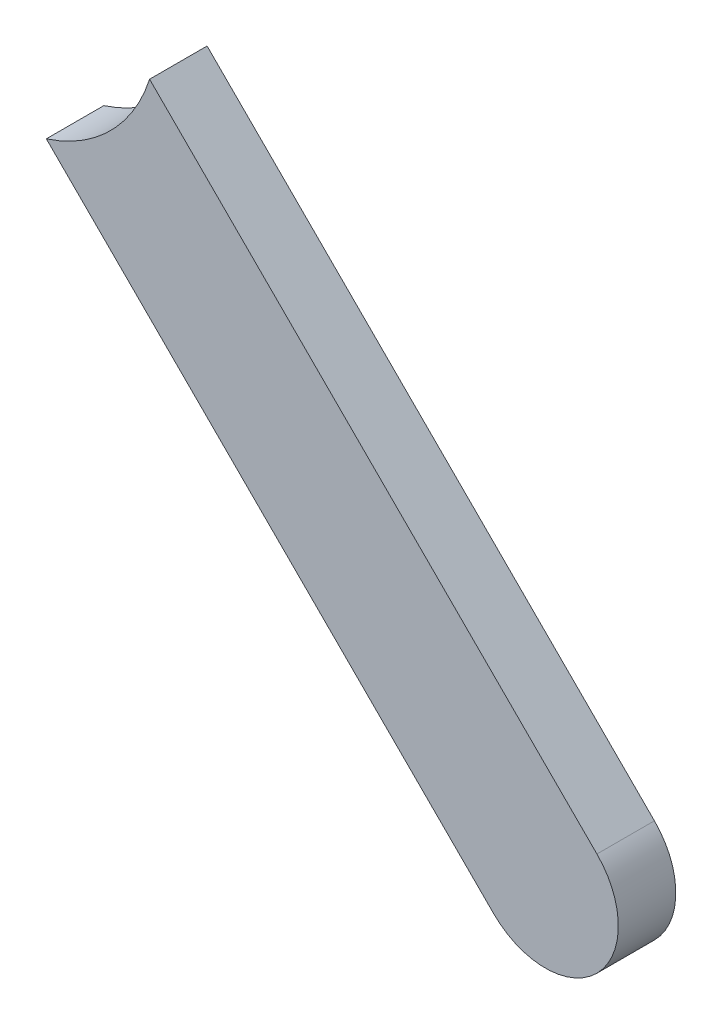
ISO-10303-21;
HEADER;
FILE_DESCRIPTION(('STEP AP214'),'2;1');
FILE_NAME('part.step','',(''),(''),'','','');
FILE_SCHEMA(('AUTOMOTIVE_DESIGN { 1 0 10303 214 1 1 1 1 }'));
ENDSEC;
DATA;
#1=APPLICATION_CONTEXT('core data for automotive mechanical design processes');
#2=APPLICATION_PROTOCOL_DEFINITION('international standard','automotive_design',2000,#1);
#3=PRODUCT_CONTEXT('',#1,'mechanical');
#4=PRODUCT('Part','Part','',(#3));
#5=PRODUCT_RELATED_PRODUCT_CATEGORY('part','',(#4));
#6=PRODUCT_DEFINITION_FORMATION('','',#4);
#7=PRODUCT_DEFINITION_CONTEXT('part definition',#1,'design');
#8=PRODUCT_DEFINITION('design','',#6,#7);
#9=PRODUCT_DEFINITION_SHAPE('','',#8);
#10=(LENGTH_UNIT() NAMED_UNIT(*) SI_UNIT(.MILLI.,.METRE.));
#11=(NAMED_UNIT(*) PLANE_ANGLE_UNIT() SI_UNIT($,.RADIAN.));
#12=(NAMED_UNIT(*) SI_UNIT($,.STERADIAN.) SOLID_ANGLE_UNIT());
#13=UNCERTAINTY_MEASURE_WITH_UNIT(LENGTH_MEASURE(1.E-05),#10,'distance_accuracy_value','');
#14=(GEOMETRIC_REPRESENTATION_CONTEXT(3) GLOBAL_UNCERTAINTY_ASSIGNED_CONTEXT((#13)) GLOBAL_UNIT_ASSIGNED_CONTEXT((#10,
#11,#12)) REPRESENTATION_CONTEXT('',''));
#15=CARTESIAN_POINT('',(0.,0.,0.));
#16=DIRECTION('',(0.,0.,1.));
#17=DIRECTION('',(1.,0.,0.));
#18=AXIS2_PLACEMENT_3D('',#15,#16,#17);
#19=CARTESIAN_POINT('',(94.0223271411441,75.1604637788559,0.));
#20=DIRECTION('',(0.707106781186545,0.70710678118655,0.));
#21=DIRECTION('',(0.70710678118655,-0.707106781186545,0.));
#22=AXIS2_PLACEMENT_3D('',#19,#20,#21);
#23=PLANE('',#22);
#24=DIRECTION('',(0.70710678118655,-0.707106781186545,0.));
#25=VECTOR('',#24,1.);
#26=CARTESIAN_POINT('',(93.67339406,75.50939686,0.1999996));
#27=LINE('',#26,#25);
#28=CARTESIAN_POINT('',(94.0223271411441,75.1604637788559,0.1999996));
#29=VERTEX_POINT('',#28);
#30=CARTESIAN_POINT('',(95.57839406,73.60439686,0.1999996));
#31=VERTEX_POINT('',#30);
#32=EDGE_CURVE('E11',#29,#31,#27,.T.);
#33=ORIENTED_EDGE('',*,*,#32,.F.);
#34=DIRECTION('',(0.,0.,1.));
#35=VECTOR('',#34,1.);
#36=CARTESIAN_POINT('',(94.0223271411441,75.1604637788559,0.));
#37=LINE('',#36,#35);
#38=CARTESIAN_POINT('',(94.0223271411441,75.1604637788559,0.));
#39=VERTEX_POINT('',#38);
#40=EDGE_CURVE('E24',#39,#29,#37,.T.);
#41=ORIENTED_EDGE('',*,*,#40,.F.);
#42=DIRECTION('',(0.70710678118655,-0.707106781186545,0.));
#43=VECTOR('',#42,1.);
#44=CARTESIAN_POINT('',(93.67339406,75.50939686,0.));
#45=LINE('',#44,#43);
#46=CARTESIAN_POINT('',(95.57839406,73.60439686,0.));
#47=VERTEX_POINT('',#46);
#48=EDGE_CURVE('E75',#39,#47,#45,.T.);
#49=ORIENTED_EDGE('',*,*,#48,.T.);
#50=DIRECTION('',(0.,0.,1.));
#51=VECTOR('',#50,1.);
#52=CARTESIAN_POINT('',(95.57839406,73.60439686,0.));
#53=LINE('',#52,#51);
#54=EDGE_CURVE('E37',#47,#31,#53,.T.);
#55=ORIENTED_EDGE('',*,*,#54,.T.);
#56=EDGE_LOOP('',(#33,#41,#49,#55));
#57=FACE_BOUND('',#56,.T.);
#58=ADVANCED_FACE('F17',(#57),#23,.F.);
#59=CARTESIAN_POINT('',(95.758,73.7840028,0.));
#60=DIRECTION('',(0.,0.,-1.));
#61=DIRECTION('',(-0.707106781186576,-0.70710678118652,0.));
#62=AXIS2_PLACEMENT_3D('',#59,#60,#61);
#63=CYLINDRICAL_SURFACE('',#62,0.254001156230764);
#64=CARTESIAN_POINT('',(95.758,73.7840028,0.1999996));
#65=DIRECTION('',(0.,0.,1.));
#66=DIRECTION('',(-0.707106781186576,-0.70710678118652,0.));
#67=AXIS2_PLACEMENT_3D('',#64,#65,#66);
#68=CIRCLE('',#67,0.254001156230764);
#69=CARTESIAN_POINT('',(95.93760594,73.96360874,0.1999996));
#70=VERTEX_POINT('',#69);
#71=EDGE_CURVE('E83',#31,#70,#68,.T.);
#72=ORIENTED_EDGE('',*,*,#71,.F.);
#73=ORIENTED_EDGE('',*,*,#54,.F.);
#74=CARTESIAN_POINT('',(95.758,73.7840028,0.));
#75=DIRECTION('',(0.,0.,1.));
#76=DIRECTION('',(-0.707106781186576,-0.70710678118652,0.));
#77=AXIS2_PLACEMENT_3D('',#74,#75,#76);
#78=CIRCLE('',#77,0.254001156230764);
#79=CARTESIAN_POINT('',(95.93760594,73.96360874,0.));
#80=VERTEX_POINT('',#79);
#81=EDGE_CURVE('E81',#47,#80,#78,.T.);
#82=ORIENTED_EDGE('',*,*,#81,.T.);
#83=DIRECTION('',(0.,0.,1.));
#84=VECTOR('',#83,1.);
#85=CARTESIAN_POINT('',(95.93760594,73.96360874,0.));
#86=LINE('',#85,#84);
#87=EDGE_CURVE('E67',#80,#70,#86,.T.);
#88=ORIENTED_EDGE('',*,*,#87,.T.);
#89=EDGE_LOOP('',(#72,#73,#82,#88));
#90=FACE_BOUND('',#89,.T.);
#91=ADVANCED_FACE('F89',(#90),#63,.T.);
#92=CARTESIAN_POINT('',(95.93760594,73.96360874,0.));
#93=DIRECTION('',(-0.707106781186548,-0.707106781186548,0.));
#94=DIRECTION('',(-0.707106781186548,0.707106781186548,0.));
#95=AXIS2_PLACEMENT_3D('',#92,#93,#94);
#96=PLANE('',#95);
#97=DIRECTION('',(-0.707106781186548,0.707106781186548,0.));
#98=VECTOR('',#97,1.);
#99=CARTESIAN_POINT('',(95.93760594,73.96360874,0.1999996));
#100=LINE('',#99,#98);
#101=CARTESIAN_POINT('',(94.3815390211441,75.5196756588559,0.1999996));
#102=VERTEX_POINT('',#101);
#103=EDGE_CURVE('E71',#70,#102,#100,.T.);
#104=ORIENTED_EDGE('',*,*,#103,.F.);
#105=ORIENTED_EDGE('',*,*,#87,.F.);
#106=DIRECTION('',(-0.707106781186548,0.707106781186548,0.));
#107=VECTOR('',#106,1.);
#108=CARTESIAN_POINT('',(95.93760594,73.96360874,0.));
#109=LINE('',#108,#107);
#110=CARTESIAN_POINT('',(94.3815390211441,75.5196756588559,0.));
#111=VERTEX_POINT('',#110);
#112=EDGE_CURVE('E63',#80,#111,#109,.T.);
#113=ORIENTED_EDGE('',*,*,#112,.T.);
#114=DIRECTION('',(0.,0.,1.));
#115=VECTOR('',#114,1.);
#116=CARTESIAN_POINT('',(94.3815390211441,75.5196756588559,0.));
#117=LINE('',#116,#115);
#118=EDGE_CURVE('E53',#111,#102,#117,.T.);
#119=ORIENTED_EDGE('',*,*,#118,.T.);
#120=EDGE_LOOP('',(#104,#105,#113,#119));
#121=FACE_BOUND('',#120,.T.);
#122=ADVANCED_FACE('F66',(#121),#96,.F.);
#123=CARTESIAN_POINT('',(93.853,75.6890028,0.));
#124=DIRECTION('',(0.,0.,-1.));
#125=DIRECTION('',(1.,0.,0.));
#126=AXIS2_PLACEMENT_3D('',#123,#124,#125);
#127=CYLINDRICAL_SURFACE('',#126,0.55500016);
#128=ORIENTED_EDGE('',*,*,#40,.T.);
#129=CARTESIAN_POINT('',(93.853,75.6890028,0.1999996));
#130=DIRECTION('',(0.,0.,1.));
#131=DIRECTION('',(1.,0.,0.));
#132=AXIS2_PLACEMENT_3D('',#129,#130,#131);
#133=CIRCLE('',#132,0.55500016);
#134=EDGE_CURVE('E59',#29,#102,#133,.T.);
#135=ORIENTED_EDGE('',*,*,#134,.T.);
#136=ORIENTED_EDGE('',*,*,#118,.F.);
#137=CARTESIAN_POINT('',(93.853,75.6890028,0.));
#138=DIRECTION('',(0.,0.,1.));
#139=DIRECTION('',(1.,0.,0.));
#140=AXIS2_PLACEMENT_3D('',#137,#138,#139);
#141=CIRCLE('',#140,0.55500016);
#142=EDGE_CURVE('E57',#39,#111,#141,.T.);
#143=ORIENTED_EDGE('',*,*,#142,.F.);
#144=EDGE_LOOP('',(#128,#135,#136,#143));
#145=FACE_BOUND('',#144,.T.);
#146=ADVANCED_FACE('F55',(#145),#127,.F.);
#147=CARTESIAN_POINT('',(93.67339406,75.50939686,0.));
#148=DIRECTION('',(0.,0.,-1.));
#149=DIRECTION('',(-1.,0.,0.));
#150=AXIS2_PLACEMENT_3D('',#147,#148,#149);
#151=PLANE('',#150);
#152=ORIENTED_EDGE('',*,*,#48,.F.);
#153=ORIENTED_EDGE('',*,*,#142,.T.);
#154=ORIENTED_EDGE('',*,*,#112,.F.);
#155=ORIENTED_EDGE('',*,*,#81,.F.);
#156=EDGE_LOOP('',(#152,#153,#154,#155));
#157=FACE_BOUND('',#156,.T.);
#158=ADVANCED_FACE('F74',(#157),#151,.T.);
#159=CARTESIAN_POINT('',(93.67339406,75.50939686,0.1999996));
#160=DIRECTION('',(0.,0.,-1.));
#161=DIRECTION('',(-1.,0.,0.));
#162=AXIS2_PLACEMENT_3D('',#159,#160,#161);
#163=PLANE('',#162);
#164=ORIENTED_EDGE('',*,*,#134,.F.);
#165=ORIENTED_EDGE('',*,*,#32,.T.);
#166=ORIENTED_EDGE('',*,*,#71,.T.);
#167=ORIENTED_EDGE('',*,*,#103,.T.);
#168=EDGE_LOOP('',(#164,#165,#166,#167));
#169=FACE_BOUND('',#168,.T.);
#170=ADVANCED_FACE('F91',(#169),#163,.F.);
#171=CLOSED_SHELL('',(#58,#91,#122,#146,#158,#170));
#172=MANIFOLD_SOLID_BREP('B1',#171);
#173=ADVANCED_BREP_SHAPE_REPRESENTATION('',(#18,#172),#14);
#174=SHAPE_DEFINITION_REPRESENTATION(#9,#173);
ENDSEC;
END-ISO-10303-21;
